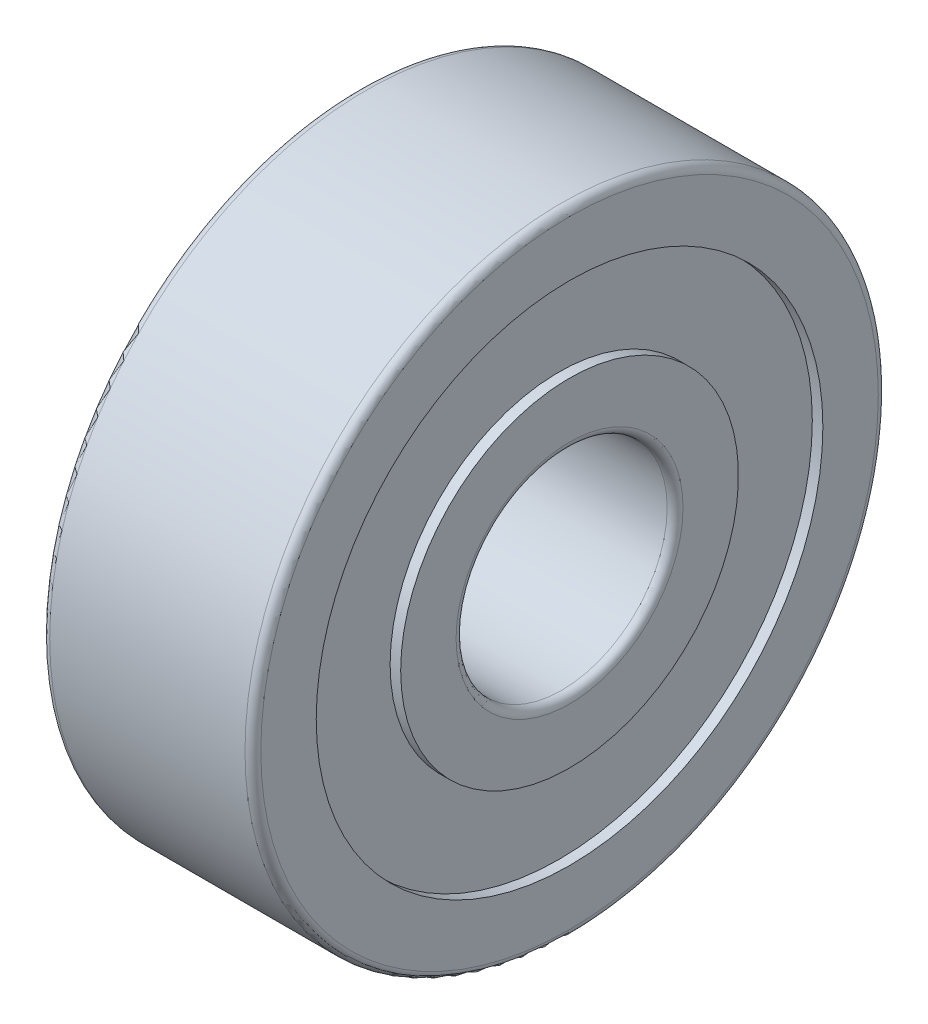
ISO-10303-21;
HEADER;
FILE_DESCRIPTION(('STEP AP214'),'2;1');
FILE_NAME('part.step','',(''),(''),'','','');
FILE_SCHEMA(('AUTOMOTIVE_DESIGN { 1 0 10303 214 1 1 1 1 }'));
ENDSEC;
DATA;
#1=APPLICATION_CONTEXT('core data for automotive mechanical design processes');
#2=APPLICATION_PROTOCOL_DEFINITION('international standard','automotive_design',2000,#1);
#3=PRODUCT_CONTEXT('',#1,'mechanical');
#4=PRODUCT('Part','Part','',(#3));
#5=PRODUCT_RELATED_PRODUCT_CATEGORY('part','',(#4));
#6=PRODUCT_DEFINITION_FORMATION('','',#4);
#7=PRODUCT_DEFINITION_CONTEXT('part definition',#1,'design');
#8=PRODUCT_DEFINITION('design','',#6,#7);
#9=PRODUCT_DEFINITION_SHAPE('','',#8);
#10=(LENGTH_UNIT() NAMED_UNIT(*) SI_UNIT(.MILLI.,.METRE.));
#11=(NAMED_UNIT(*) PLANE_ANGLE_UNIT() SI_UNIT($,.RADIAN.));
#12=(NAMED_UNIT(*) SI_UNIT($,.STERADIAN.) SOLID_ANGLE_UNIT());
#13=UNCERTAINTY_MEASURE_WITH_UNIT(LENGTH_MEASURE(1.E-05),#10,'distance_accuracy_value','');
#14=(GEOMETRIC_REPRESENTATION_CONTEXT(3) GLOBAL_UNCERTAINTY_ASSIGNED_CONTEXT((#13)) GLOBAL_UNIT_ASSIGNED_CONTEXT((#10,
#11,#12)) REPRESENTATION_CONTEXT('',''));
#15=CARTESIAN_POINT('',(0.,0.,0.));
#16=DIRECTION('',(0.,0.,1.));
#17=DIRECTION('',(1.,0.,0.));
#18=AXIS2_PLACEMENT_3D('',#15,#16,#17);
#19=CARTESIAN_POINT('',(-4.,12.,0.));
#20=DIRECTION('',(1.,0.,0.));
#21=DIRECTION('',(0.,0.,-1.));
#22=AXIS2_PLACEMENT_3D('',#19,#20,#21);
#23=PLANE('',#22);
#24=CARTESIAN_POINT('',(-4.,0.,0.));
#25=DIRECTION('',(1.,0.,0.));
#26=DIRECTION('',(0.,0.,-1.));
#27=AXIS2_PLACEMENT_3D('',#24,#25,#26);
#28=CIRCLE('',#27,11.7);
#29=CARTESIAN_POINT('',(-4.,0.,-11.7));
#30=VERTEX_POINT('',#29);
#31=EDGE_CURVE('E48',#30,#30,#28,.F.);
#32=ORIENTED_EDGE('',*,*,#31,.T.);
#33=EDGE_LOOP('',(#32));
#34=FACE_BOUND('',#33,.T.);
#35=CARTESIAN_POINT('',(-4.,0.,0.));
#36=DIRECTION('',(-1.,0.,0.));
#37=DIRECTION('',(0.,0.,1.));
#38=AXIS2_PLACEMENT_3D('',#35,#36,#37);
#39=CIRCLE('',#38,9.6);
#40=CARTESIAN_POINT('',(-4.,0.,9.6));
#41=VERTEX_POINT('',#40);
#42=EDGE_CURVE('E65',#41,#41,#39,.T.);
#43=ORIENTED_EDGE('',*,*,#42,.F.);
#44=EDGE_LOOP('',(#43));
#45=FACE_BOUND('',#44,.T.);
#46=ADVANCED_FACE('F33',(#34,#45),#23,.F.);
#47=CARTESIAN_POINT('',(0.,0.,0.));
#48=DIRECTION('',(-1.,0.,0.));
#49=DIRECTION('',(0.,0.,1.));
#50=AXIS2_PLACEMENT_3D('',#47,#48,#49);
#51=CYLINDRICAL_SURFACE('',#50,9.6);
#52=CARTESIAN_POINT('',(-3.6,0.,0.));
#53=DIRECTION('',(-1.,0.,0.));
#54=DIRECTION('',(0.,0.,1.));
#55=AXIS2_PLACEMENT_3D('',#52,#53,#54);
#56=CIRCLE('',#55,9.6);
#57=CARTESIAN_POINT('',(-3.6,0.,9.6));
#58=VERTEX_POINT('',#57);
#59=EDGE_CURVE('E68',#58,#58,#56,.T.);
#60=ORIENTED_EDGE('',*,*,#59,.F.);
#61=EDGE_LOOP('',(#60));
#62=FACE_BOUND('',#61,.T.);
#63=ORIENTED_EDGE('',*,*,#42,.T.);
#64=EDGE_LOOP('',(#63));
#65=FACE_BOUND('',#64,.T.);
#66=ADVANCED_FACE('F122',(#62,#65),#51,.F.);
#67=CARTESIAN_POINT('',(-3.6,9.6,0.));
#68=DIRECTION('',(1.,0.,0.));
#69=DIRECTION('',(0.,0.,-1.));
#70=AXIS2_PLACEMENT_3D('',#67,#68,#69);
#71=PLANE('',#70);
#72=CARTESIAN_POINT('',(-3.6,0.,0.));
#73=DIRECTION('',(-1.,0.,0.));
#74=DIRECTION('',(0.,0.,1.));
#75=AXIS2_PLACEMENT_3D('',#72,#73,#74);
#76=CIRCLE('',#75,6.4);
#77=CARTESIAN_POINT('',(-3.6,0.,6.4));
#78=VERTEX_POINT('',#77);
#79=EDGE_CURVE('E71',#78,#78,#76,.T.);
#80=ORIENTED_EDGE('',*,*,#79,.F.);
#81=EDGE_LOOP('',(#80));
#82=FACE_BOUND('',#81,.T.);
#83=ORIENTED_EDGE('',*,*,#59,.T.);
#84=EDGE_LOOP('',(#83));
#85=FACE_BOUND('',#84,.T.);
#86=ADVANCED_FACE('F128',(#82,#85),#71,.F.);
#87=CARTESIAN_POINT('',(0.,0.,0.));
#88=DIRECTION('',(-1.,0.,0.));
#89=DIRECTION('',(0.,0.,1.));
#90=AXIS2_PLACEMENT_3D('',#87,#88,#89);
#91=CYLINDRICAL_SURFACE('',#90,6.4);
#92=CARTESIAN_POINT('',(-4.,0.,0.));
#93=DIRECTION('',(-1.,0.,0.));
#94=DIRECTION('',(0.,0.,1.));
#95=AXIS2_PLACEMENT_3D('',#92,#93,#94);
#96=CIRCLE('',#95,6.4);
#97=CARTESIAN_POINT('',(-4.,0.,6.4));
#98=VERTEX_POINT('',#97);
#99=EDGE_CURVE('E74',#98,#98,#96,.T.);
#100=ORIENTED_EDGE('',*,*,#99,.F.);
#101=EDGE_LOOP('',(#100));
#102=FACE_BOUND('',#101,.T.);
#103=ORIENTED_EDGE('',*,*,#79,.T.);
#104=EDGE_LOOP('',(#103));
#105=FACE_BOUND('',#104,.T.);
#106=ADVANCED_FACE('F189',(#102,#105),#91,.T.);
#107=CARTESIAN_POINT('',(-4.,6.4,0.));
#108=DIRECTION('',(1.,0.,0.));
#109=DIRECTION('',(0.,0.,-1.));
#110=AXIS2_PLACEMENT_3D('',#107,#108,#109);
#111=PLANE('',#110);
#112=CARTESIAN_POINT('',(-4.,0.,0.));
#113=DIRECTION('',(1.,0.,0.));
#114=DIRECTION('',(0.,0.,-1.));
#115=AXIS2_PLACEMENT_3D('',#112,#113,#114);
#116=CIRCLE('',#115,4.3);
#117=CARTESIAN_POINT('',(-4.,0.,-4.3));
#118=VERTEX_POINT('',#117);
#119=EDGE_CURVE('E56',#118,#118,#116,.T.);
#120=ORIENTED_EDGE('',*,*,#119,.T.);
#121=EDGE_LOOP('',(#120));
#122=FACE_BOUND('',#121,.T.);
#123=ORIENTED_EDGE('',*,*,#99,.T.);
#124=EDGE_LOOP('',(#123));
#125=FACE_BOUND('',#124,.T.);
#126=ADVANCED_FACE('F118',(#122,#125),#111,.F.);
#127=CARTESIAN_POINT('',(0.,0.,0.));
#128=DIRECTION('',(-1.,0.,0.));
#129=DIRECTION('',(0.,0.,1.));
#130=AXIS2_PLACEMENT_3D('',#127,#128,#129);
#131=CYLINDRICAL_SURFACE('',#130,4.);
#132=CARTESIAN_POINT('',(-3.7,0.,0.));
#133=DIRECTION('',(1.,0.,0.));
#134=DIRECTION('',(0.,0.,-1.));
#135=AXIS2_PLACEMENT_3D('',#132,#133,#134);
#136=CIRCLE('',#135,4.);
#137=CARTESIAN_POINT('',(-3.7,0.,-4.));
#138=VERTEX_POINT('',#137);
#139=EDGE_CURVE('E59',#138,#138,#136,.F.);
#140=ORIENTED_EDGE('',*,*,#139,.T.);
#141=EDGE_LOOP('',(#140));
#142=FACE_BOUND('',#141,.T.);
#143=CARTESIAN_POINT('',(3.7,0.,0.));
#144=DIRECTION('',(-1.,0.,0.));
#145=DIRECTION('',(0.,0.,1.));
#146=AXIS2_PLACEMENT_3D('',#143,#144,#145);
#147=CIRCLE('',#146,4.);
#148=CARTESIAN_POINT('',(3.7,0.,4.));
#149=VERTEX_POINT('',#148);
#150=EDGE_CURVE('E62',#149,#149,#147,.F.);
#151=ORIENTED_EDGE('',*,*,#150,.T.);
#152=EDGE_LOOP('',(#151));
#153=FACE_BOUND('',#152,.T.);
#154=ADVANCED_FACE('F112',(#142,#153),#131,.F.);
#155=CARTESIAN_POINT('',(4.,6.4,0.));
#156=DIRECTION('',(-1.,0.,0.));
#157=DIRECTION('',(0.,0.,1.));
#158=AXIS2_PLACEMENT_3D('',#155,#156,#157);
#159=PLANE('',#158);
#160=CARTESIAN_POINT('',(4.,0.,0.));
#161=DIRECTION('',(-1.,0.,0.));
#162=DIRECTION('',(0.,0.,1.));
#163=AXIS2_PLACEMENT_3D('',#160,#161,#162);
#164=CIRCLE('',#163,4.3);
#165=CARTESIAN_POINT('',(4.,0.,4.3));
#166=VERTEX_POINT('',#165);
#167=EDGE_CURVE('E53',#166,#166,#164,.T.);
#168=ORIENTED_EDGE('',*,*,#167,.T.);
#169=EDGE_LOOP('',(#168));
#170=FACE_BOUND('',#169,.T.);
#171=CARTESIAN_POINT('',(4.,0.,0.));
#172=DIRECTION('',(-1.,0.,0.));
#173=DIRECTION('',(0.,0.,1.));
#174=AXIS2_PLACEMENT_3D('',#171,#172,#173);
#175=CIRCLE('',#174,6.4);
#176=CARTESIAN_POINT('',(4.,0.,6.4));
#177=VERTEX_POINT('',#176);
#178=EDGE_CURVE('E77',#177,#177,#175,.T.);
#179=ORIENTED_EDGE('',*,*,#178,.F.);
#180=EDGE_LOOP('',(#179));
#181=FACE_BOUND('',#180,.T.);
#182=ADVANCED_FACE('F107',(#170,#181),#159,.F.);
#183=CARTESIAN_POINT('',(0.,0.,0.));
#184=DIRECTION('',(-1.,0.,0.));
#185=DIRECTION('',(0.,0.,1.));
#186=AXIS2_PLACEMENT_3D('',#183,#184,#185);
#187=CYLINDRICAL_SURFACE('',#186,6.4);
#188=CARTESIAN_POINT('',(3.6,0.,0.));
#189=DIRECTION('',(-1.,0.,0.));
#190=DIRECTION('',(0.,0.,1.));
#191=AXIS2_PLACEMENT_3D('',#188,#189,#190);
#192=CIRCLE('',#191,6.4);
#193=CARTESIAN_POINT('',(3.6,0.,6.4));
#194=VERTEX_POINT('',#193);
#195=EDGE_CURVE('E80',#194,#194,#192,.T.);
#196=ORIENTED_EDGE('',*,*,#195,.F.);
#197=EDGE_LOOP('',(#196));
#198=FACE_BOUND('',#197,.T.);
#199=ORIENTED_EDGE('',*,*,#178,.T.);
#200=EDGE_LOOP('',(#199));
#201=FACE_BOUND('',#200,.T.);
#202=ADVANCED_FACE('F101',(#198,#201),#187,.T.);
#203=CARTESIAN_POINT('',(3.6,9.6,0.));
#204=DIRECTION('',(-1.,0.,0.));
#205=DIRECTION('',(0.,0.,1.));
#206=AXIS2_PLACEMENT_3D('',#203,#204,#205);
#207=PLANE('',#206);
#208=CARTESIAN_POINT('',(3.6,0.,0.));
#209=DIRECTION('',(-1.,0.,0.));
#210=DIRECTION('',(0.,0.,1.));
#211=AXIS2_PLACEMENT_3D('',#208,#209,#210);
#212=CIRCLE('',#211,9.6);
#213=CARTESIAN_POINT('',(3.6,0.,9.6));
#214=VERTEX_POINT('',#213);
#215=EDGE_CURVE('E83',#214,#214,#212,.T.);
#216=ORIENTED_EDGE('',*,*,#215,.F.);
#217=EDGE_LOOP('',(#216));
#218=FACE_BOUND('',#217,.T.);
#219=ORIENTED_EDGE('',*,*,#195,.T.);
#220=EDGE_LOOP('',(#219));
#221=FACE_BOUND('',#220,.T.);
#222=ADVANCED_FACE('F95',(#218,#221),#207,.F.);
#223=CARTESIAN_POINT('',(0.,0.,0.));
#224=DIRECTION('',(-1.,0.,0.));
#225=DIRECTION('',(0.,0.,1.));
#226=AXIS2_PLACEMENT_3D('',#223,#224,#225);
#227=CYLINDRICAL_SURFACE('',#226,9.6);
#228=CARTESIAN_POINT('',(4.,0.,0.));
#229=DIRECTION('',(-1.,0.,0.));
#230=DIRECTION('',(0.,0.,1.));
#231=AXIS2_PLACEMENT_3D('',#228,#229,#230);
#232=CIRCLE('',#231,9.6);
#233=CARTESIAN_POINT('',(4.,0.,9.6));
#234=VERTEX_POINT('',#233);
#235=EDGE_CURVE('E86',#234,#234,#232,.T.);
#236=ORIENTED_EDGE('',*,*,#235,.F.);
#237=EDGE_LOOP('',(#236));
#238=FACE_BOUND('',#237,.T.);
#239=ORIENTED_EDGE('',*,*,#215,.T.);
#240=EDGE_LOOP('',(#239));
#241=FACE_BOUND('',#240,.T.);
#242=ADVANCED_FACE('F92',(#238,#241),#227,.F.);
#243=CARTESIAN_POINT('',(4.,12.,0.));
#244=DIRECTION('',(-1.,0.,0.));
#245=DIRECTION('',(0.,0.,1.));
#246=AXIS2_PLACEMENT_3D('',#243,#244,#245);
#247=PLANE('',#246);
#248=CARTESIAN_POINT('',(4.,0.,0.));
#249=DIRECTION('',(-1.,0.,0.));
#250=DIRECTION('',(0.,0.,1.));
#251=AXIS2_PLACEMENT_3D('',#248,#249,#250);
#252=CIRCLE('',#251,11.7);
#253=CARTESIAN_POINT('',(4.,0.,11.7));
#254=VERTEX_POINT('',#253);
#255=EDGE_CURVE('E10',#254,#254,#252,.F.);
#256=ORIENTED_EDGE('',*,*,#255,.T.);
#257=EDGE_LOOP('',(#256));
#258=FACE_BOUND('',#257,.T.);
#259=ORIENTED_EDGE('',*,*,#235,.T.);
#260=EDGE_LOOP('',(#259));
#261=FACE_BOUND('',#260,.T.);
#262=ADVANCED_FACE('F90',(#258,#261),#247,.F.);
#263=CARTESIAN_POINT('',(0.,0.,0.));
#264=DIRECTION('',(-1.,0.,0.));
#265=DIRECTION('',(0.,0.,1.));
#266=AXIS2_PLACEMENT_3D('',#263,#264,#265);
#267=CYLINDRICAL_SURFACE('',#266,12.);
#268=CARTESIAN_POINT('',(-3.7,0.,0.));
#269=DIRECTION('',(1.,0.,0.));
#270=DIRECTION('',(0.,0.,-1.));
#271=AXIS2_PLACEMENT_3D('',#268,#269,#270);
#272=CIRCLE('',#271,12.);
#273=CARTESIAN_POINT('',(-3.7,0.,-12.));
#274=VERTEX_POINT('',#273);
#275=EDGE_CURVE('E40',#274,#274,#272,.T.);
#276=ORIENTED_EDGE('',*,*,#275,.T.);
#277=EDGE_LOOP('',(#276));
#278=FACE_BOUND('',#277,.T.);
#279=CARTESIAN_POINT('',(3.7,0.,0.));
#280=DIRECTION('',(-1.,0.,0.));
#281=DIRECTION('',(0.,0.,1.));
#282=AXIS2_PLACEMENT_3D('',#279,#280,#281);
#283=CIRCLE('',#282,12.);
#284=CARTESIAN_POINT('',(3.7,0.,12.));
#285=VERTEX_POINT('',#284);
#286=EDGE_CURVE('E44',#285,#285,#283,.T.);
#287=ORIENTED_EDGE('',*,*,#286,.T.);
#288=EDGE_LOOP('',(#287));
#289=FACE_BOUND('',#288,.T.);
#290=ADVANCED_FACE('F138',(#278,#289),#267,.T.);
#291=CARTESIAN_POINT('',(-3.7,0.,0.));
#292=DIRECTION('',(1.,0.,0.));
#293=DIRECTION('',(0.,0.,-1.));
#294=AXIS2_PLACEMENT_3D('',#291,#292,#293);
#295=TOROIDAL_SURFACE('',#294,4.3,0.3);
#296=ORIENTED_EDGE('',*,*,#119,.F.);
#297=EDGE_LOOP('',(#296));
#298=FACE_BOUND('',#297,.T.);
#299=ORIENTED_EDGE('',*,*,#139,.F.);
#300=EDGE_LOOP('',(#299));
#301=FACE_BOUND('',#300,.T.);
#302=ADVANCED_FACE('F134',(#298,#301),#295,.T.);
#303=CARTESIAN_POINT('',(3.7,0.,0.));
#304=DIRECTION('',(-1.,0.,0.));
#305=DIRECTION('',(0.,0.,1.));
#306=AXIS2_PLACEMENT_3D('',#303,#304,#305);
#307=TOROIDAL_SURFACE('',#306,4.3,0.3);
#308=ORIENTED_EDGE('',*,*,#150,.F.);
#309=EDGE_LOOP('',(#308));
#310=FACE_BOUND('',#309,.T.);
#311=ORIENTED_EDGE('',*,*,#167,.F.);
#312=EDGE_LOOP('',(#311));
#313=FACE_BOUND('',#312,.T.);
#314=ADVANCED_FACE('F137',(#310,#313),#307,.T.);
#315=CARTESIAN_POINT('',(-3.7,0.,0.));
#316=DIRECTION('',(1.,0.,0.));
#317=DIRECTION('',(0.,0.,-1.));
#318=AXIS2_PLACEMENT_3D('',#315,#316,#317);
#319=TOROIDAL_SURFACE('',#318,11.7,0.3);
#320=ORIENTED_EDGE('',*,*,#275,.F.);
#321=EDGE_LOOP('',(#320));
#322=FACE_BOUND('',#321,.T.);
#323=ORIENTED_EDGE('',*,*,#31,.F.);
#324=EDGE_LOOP('',(#323));
#325=FACE_BOUND('',#324,.T.);
#326=ADVANCED_FACE('F141',(#322,#325),#319,.T.);
#327=CARTESIAN_POINT('',(3.7,0.,0.));
#328=DIRECTION('',(-1.,0.,0.));
#329=DIRECTION('',(0.,0.,1.));
#330=AXIS2_PLACEMENT_3D('',#327,#328,#329);
#331=TOROIDAL_SURFACE('',#330,11.7,0.3);
#332=ORIENTED_EDGE('',*,*,#255,.F.);
#333=EDGE_LOOP('',(#332));
#334=FACE_BOUND('',#333,.T.);
#335=ORIENTED_EDGE('',*,*,#286,.F.);
#336=EDGE_LOOP('',(#335));
#337=FACE_BOUND('',#336,.T.);
#338=ADVANCED_FACE('F35',(#334,#337),#331,.T.);
#339=CLOSED_SHELL('',(#46,#66,#86,#106,#126,#154,#182,#202,#222,#242,#262,#290,#302,#314,#326,#338));
#340=MANIFOLD_SOLID_BREP('B2',#339);
#341=ADVANCED_BREP_SHAPE_REPRESENTATION('',(#18,#340),#14);
#342=SHAPE_DEFINITION_REPRESENTATION(#9,#341);
ENDSEC;
END-ISO-10303-21;
